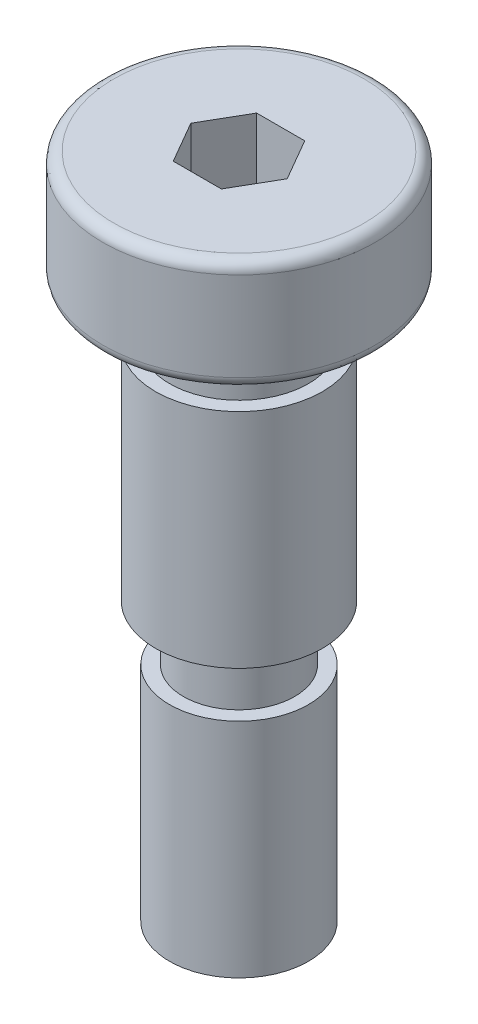
ISO-10303-21;
HEADER;
FILE_DESCRIPTION(('STEP AP214'),'2;1');
FILE_NAME('part.step','',(''),(''),'','','');
FILE_SCHEMA(('AUTOMOTIVE_DESIGN { 1 0 10303 214 1 1 1 1 }'));
ENDSEC;
DATA;
#1=APPLICATION_CONTEXT('core data for automotive mechanical design processes');
#2=APPLICATION_PROTOCOL_DEFINITION('international standard','automotive_design',2000,#1);
#3=PRODUCT_CONTEXT('',#1,'mechanical');
#4=PRODUCT('Part','Part','',(#3));
#5=PRODUCT_RELATED_PRODUCT_CATEGORY('part','',(#4));
#6=PRODUCT_DEFINITION_FORMATION('','',#4);
#7=PRODUCT_DEFINITION_CONTEXT('part definition',#1,'design');
#8=PRODUCT_DEFINITION('design','',#6,#7);
#9=PRODUCT_DEFINITION_SHAPE('','',#8);
#10=(LENGTH_UNIT() NAMED_UNIT(*) SI_UNIT(.MILLI.,.METRE.));
#11=(NAMED_UNIT(*) PLANE_ANGLE_UNIT() SI_UNIT($,.RADIAN.));
#12=(NAMED_UNIT(*) SI_UNIT($,.STERADIAN.) SOLID_ANGLE_UNIT());
#13=UNCERTAINTY_MEASURE_WITH_UNIT(LENGTH_MEASURE(1.E-05),#10,'distance_accuracy_value','');
#14=(GEOMETRIC_REPRESENTATION_CONTEXT(3) GLOBAL_UNCERTAINTY_ASSIGNED_CONTEXT((#13)) GLOBAL_UNIT_ASSIGNED_CONTEXT((#10,
#11,#12)) REPRESENTATION_CONTEXT('',''));
#15=CARTESIAN_POINT('',(0.,0.,0.));
#16=DIRECTION('',(0.,0.,1.));
#17=DIRECTION('',(1.,0.,0.));
#18=AXIS2_PLACEMENT_3D('',#15,#16,#17);
#19=CARTESIAN_POINT('',(0.,24.,0.));
#20=DIRECTION('',(0.,-1.,0.));
#21=DIRECTION('',(0.,0.,-1.));
#22=AXIS2_PLACEMENT_3D('',#19,#20,#21);
#23=PLANE('',#22);
#24=DIRECTION('',(-1.,0.,0.));
#25=VECTOR('',#24,1.);
#26=CARTESIAN_POINT('',(0.866025403784438,24.,-1.5));
#27=LINE('',#26,#25);
#28=CARTESIAN_POINT('',(0.866025403784438,24.,-1.5));
#29=VERTEX_POINT('',#28);
#30=CARTESIAN_POINT('',(-0.866025403784439,24.,-1.5));
#31=VERTEX_POINT('',#30);
#32=EDGE_CURVE('E126',#29,#31,#27,.T.);
#33=ORIENTED_EDGE('',*,*,#32,.F.);
#34=DIRECTION('',(-0.5,0.,-0.866025403784438));
#35=VECTOR('',#34,1.);
#36=CARTESIAN_POINT('',(1.73205080756888,24.,0.));
#37=LINE('',#36,#35);
#38=CARTESIAN_POINT('',(1.73205080756888,24.,0.));
#39=VERTEX_POINT('',#38);
#40=EDGE_CURVE('E52',#39,#29,#37,.T.);
#41=ORIENTED_EDGE('',*,*,#40,.F.);
#42=DIRECTION('',(0.5,0.,-0.866025403784438));
#43=VECTOR('',#42,1.);
#44=CARTESIAN_POINT('',(0.866025403784438,24.,1.5));
#45=LINE('',#44,#43);
#46=CARTESIAN_POINT('',(0.866025403784438,24.,1.5));
#47=VERTEX_POINT('',#46);
#48=EDGE_CURVE('E135',#47,#39,#45,.T.);
#49=ORIENTED_EDGE('',*,*,#48,.F.);
#50=DIRECTION('',(1.,0.,0.));
#51=VECTOR('',#50,1.);
#52=CARTESIAN_POINT('',(-0.866025403784439,24.,1.5));
#53=LINE('',#52,#51);
#54=CARTESIAN_POINT('',(-0.866025403784439,24.,1.5));
#55=VERTEX_POINT('',#54);
#56=EDGE_CURVE('E133',#55,#47,#53,.T.);
#57=ORIENTED_EDGE('',*,*,#56,.F.);
#58=DIRECTION('',(0.5,0.,0.866025403784439));
#59=VECTOR('',#58,1.);
#60=CARTESIAN_POINT('',(-1.73205080756888,24.,0.));
#61=LINE('',#60,#59);
#62=CARTESIAN_POINT('',(-1.73205080756888,24.,0.));
#63=VERTEX_POINT('',#62);
#64=EDGE_CURVE('E100',#63,#55,#61,.T.);
#65=ORIENTED_EDGE('',*,*,#64,.F.);
#66=DIRECTION('',(-0.5,0.,0.866025403784439));
#67=VECTOR('',#66,1.);
#68=CARTESIAN_POINT('',(-0.866025403784439,24.,-1.5));
#69=LINE('',#68,#67);
#70=EDGE_CURVE('E129',#31,#63,#69,.T.);
#71=ORIENTED_EDGE('',*,*,#70,.F.);
#72=EDGE_LOOP('',(#33,#41,#49,#57,#65,#71));
#73=FACE_BOUND('',#72,.T.);
#74=CARTESIAN_POINT('',(0.,24.,0.));
#75=DIRECTION('',(0.,-1.,0.));
#76=DIRECTION('',(0.,0.,-1.));
#77=AXIS2_PLACEMENT_3D('',#74,#75,#76);
#78=CIRCLE('',#77,4.5);
#79=CARTESIAN_POINT('',(0.,24.,-4.5));
#80=VERTEX_POINT('',#79);
#81=EDGE_CURVE('E11',#80,#80,#78,.T.);
#82=ORIENTED_EDGE('',*,*,#81,.F.);
#83=EDGE_LOOP('',(#82));
#84=FACE_BOUND('',#83,.T.);
#85=ADVANCED_FACE('F38',(#73,#84),#23,.F.);
#86=CARTESIAN_POINT('',(0.,23.6,0.));
#87=DIRECTION('',(0.,-1.,0.));
#88=DIRECTION('',(0.,0.,-1.));
#89=AXIS2_PLACEMENT_3D('',#86,#87,#88);
#90=TOROIDAL_SURFACE('',#89,4.5,0.400000000000001);
#91=CARTESIAN_POINT('',(0.,23.6,0.));
#92=DIRECTION('',(0.,-1.,0.));
#93=DIRECTION('',(0.,0.,-1.));
#94=AXIS2_PLACEMENT_3D('',#91,#92,#93);
#95=CIRCLE('',#94,4.9);
#96=CARTESIAN_POINT('',(0.,23.6,-4.9));
#97=VERTEX_POINT('',#96);
#98=EDGE_CURVE('E45',#97,#97,#95,.T.);
#99=ORIENTED_EDGE('',*,*,#98,.F.);
#100=EDGE_LOOP('',(#99));
#101=FACE_BOUND('',#100,.T.);
#102=ORIENTED_EDGE('',*,*,#81,.T.);
#103=EDGE_LOOP('',(#102));
#104=FACE_BOUND('',#103,.T.);
#105=ADVANCED_FACE('F178',(#101,#104),#90,.T.);
#106=CARTESIAN_POINT('',(0.,0.,0.));
#107=DIRECTION('',(0.,-1.,0.));
#108=DIRECTION('',(0.,0.,-1.));
#109=AXIS2_PLACEMENT_3D('',#106,#107,#108);
#110=CYLINDRICAL_SURFACE('',#109,4.9);
#111=CARTESIAN_POINT('',(0.,20.4,0.));
#112=DIRECTION('',(0.,-1.,0.));
#113=DIRECTION('',(0.,0.,-1.));
#114=AXIS2_PLACEMENT_3D('',#111,#112,#113);
#115=CIRCLE('',#114,4.9);
#116=CARTESIAN_POINT('',(0.,20.4,-4.9));
#117=VERTEX_POINT('',#116);
#118=EDGE_CURVE('E171',#117,#117,#115,.T.);
#119=ORIENTED_EDGE('',*,*,#118,.F.);
#120=EDGE_LOOP('',(#119));
#121=FACE_BOUND('',#120,.T.);
#122=ORIENTED_EDGE('',*,*,#98,.T.);
#123=EDGE_LOOP('',(#122));
#124=FACE_BOUND('',#123,.T.);
#125=ADVANCED_FACE('F176',(#121,#124),#110,.T.);
#126=CARTESIAN_POINT('',(0.,20.4,0.));
#127=DIRECTION('',(0.,-1.,0.));
#128=DIRECTION('',(0.,0.,-1.));
#129=AXIS2_PLACEMENT_3D('',#126,#127,#128);
#130=TOROIDAL_SURFACE('',#129,4.5,0.400000000000004);
#131=CARTESIAN_POINT('',(0.,20.,0.));
#132=DIRECTION('',(0.,-1.,0.));
#133=DIRECTION('',(0.,0.,-1.));
#134=AXIS2_PLACEMENT_3D('',#131,#132,#133);
#135=CIRCLE('',#134,4.5);
#136=CARTESIAN_POINT('',(0.,20.,-4.5));
#137=VERTEX_POINT('',#136);
#138=EDGE_CURVE('E168',#137,#137,#135,.T.);
#139=ORIENTED_EDGE('',*,*,#138,.F.);
#140=EDGE_LOOP('',(#139));
#141=FACE_BOUND('',#140,.T.);
#142=ORIENTED_EDGE('',*,*,#118,.T.);
#143=EDGE_LOOP('',(#142));
#144=FACE_BOUND('',#143,.T.);
#145=ADVANCED_FACE('F239',(#141,#144),#130,.T.);
#146=CARTESIAN_POINT('',(-4.5,20.,0.));
#147=DIRECTION('',(0.,1.,0.));
#148=DIRECTION('',(0.,0.,1.));
#149=AXIS2_PLACEMENT_3D('',#146,#147,#148);
#150=PLANE('',#149);
#151=CARTESIAN_POINT('',(0.,20.,0.));
#152=DIRECTION('',(0.,-1.,0.));
#153=DIRECTION('',(0.,0.,-1.));
#154=AXIS2_PLACEMENT_3D('',#151,#152,#153);
#155=CIRCLE('',#154,2.5);
#156=CARTESIAN_POINT('',(0.,20.,-2.5));
#157=VERTEX_POINT('',#156);
#158=EDGE_CURVE('E165',#157,#157,#155,.T.);
#159=ORIENTED_EDGE('',*,*,#158,.F.);
#160=EDGE_LOOP('',(#159));
#161=FACE_BOUND('',#160,.T.);
#162=ORIENTED_EDGE('',*,*,#138,.T.);
#163=EDGE_LOOP('',(#162));
#164=FACE_BOUND('',#163,.T.);
#165=ADVANCED_FACE('F235',(#161,#164),#150,.F.);
#166=CARTESIAN_POINT('',(0.,0.,0.));
#167=DIRECTION('',(0.,-1.,0.));
#168=DIRECTION('',(0.,0.,-1.));
#169=AXIS2_PLACEMENT_3D('',#166,#167,#168);
#170=CYLINDRICAL_SURFACE('',#169,2.5);
#171=CARTESIAN_POINT('',(0.,18.,0.));
#172=DIRECTION('',(0.,-1.,0.));
#173=DIRECTION('',(0.,0.,-1.));
#174=AXIS2_PLACEMENT_3D('',#171,#172,#173);
#175=CIRCLE('',#174,2.5);
#176=CARTESIAN_POINT('',(0.,18.,-2.5));
#177=VERTEX_POINT('',#176);
#178=EDGE_CURVE('E162',#177,#177,#175,.T.);
#179=ORIENTED_EDGE('',*,*,#178,.F.);
#180=EDGE_LOOP('',(#179));
#181=FACE_BOUND('',#180,.T.);
#182=ORIENTED_EDGE('',*,*,#158,.T.);
#183=EDGE_LOOP('',(#182));
#184=FACE_BOUND('',#183,.T.);
#185=ADVANCED_FACE('F231',(#181,#184),#170,.T.);
#186=CARTESIAN_POINT('',(-2.5,18.,0.));
#187=DIRECTION('',(0.,-1.,0.));
#188=DIRECTION('',(0.,0.,-1.));
#189=AXIS2_PLACEMENT_3D('',#186,#187,#188);
#190=PLANE('',#189);
#191=CARTESIAN_POINT('',(0.,18.,0.));
#192=DIRECTION('',(0.,-1.,0.));
#193=DIRECTION('',(0.,0.,-1.));
#194=AXIS2_PLACEMENT_3D('',#191,#192,#193);
#195=CIRCLE('',#194,3.);
#196=CARTESIAN_POINT('',(0.,18.,-3.));
#197=VERTEX_POINT('',#196);
#198=EDGE_CURVE('E159',#197,#197,#195,.T.);
#199=ORIENTED_EDGE('',*,*,#198,.F.);
#200=EDGE_LOOP('',(#199));
#201=FACE_BOUND('',#200,.T.);
#202=ORIENTED_EDGE('',*,*,#178,.T.);
#203=EDGE_LOOP('',(#202));
#204=FACE_BOUND('',#203,.T.);
#205=ADVANCED_FACE('F227',(#201,#204),#190,.F.);
#206=CARTESIAN_POINT('',(0.,0.,0.));
#207=DIRECTION('',(0.,-1.,0.));
#208=DIRECTION('',(0.,0.,-1.));
#209=AXIS2_PLACEMENT_3D('',#206,#207,#208);
#210=CYLINDRICAL_SURFACE('',#209,3.);
#211=CARTESIAN_POINT('',(0.,10.,0.));
#212=DIRECTION('',(0.,-1.,0.));
#213=DIRECTION('',(0.,0.,-1.));
#214=AXIS2_PLACEMENT_3D('',#211,#212,#213);
#215=CIRCLE('',#214,3.);
#216=CARTESIAN_POINT('',(0.,10.,-3.));
#217=VERTEX_POINT('',#216);
#218=EDGE_CURVE('E156',#217,#217,#215,.T.);
#219=ORIENTED_EDGE('',*,*,#218,.F.);
#220=EDGE_LOOP('',(#219));
#221=FACE_BOUND('',#220,.T.);
#222=ORIENTED_EDGE('',*,*,#198,.T.);
#223=EDGE_LOOP('',(#222));
#224=FACE_BOUND('',#223,.T.);
#225=ADVANCED_FACE('F223',(#221,#224),#210,.T.);
#226=CARTESIAN_POINT('',(-3.,10.,0.));
#227=DIRECTION('',(0.,1.,0.));
#228=DIRECTION('',(0.,0.,1.));
#229=AXIS2_PLACEMENT_3D('',#226,#227,#228);
#230=PLANE('',#229);
#231=CARTESIAN_POINT('',(0.,10.,0.));
#232=DIRECTION('',(0.,-1.,0.));
#233=DIRECTION('',(0.,0.,-1.));
#234=AXIS2_PLACEMENT_3D('',#231,#232,#233);
#235=CIRCLE('',#234,2.);
#236=CARTESIAN_POINT('',(0.,10.,-2.));
#237=VERTEX_POINT('',#236);
#238=EDGE_CURVE('E153',#237,#237,#235,.T.);
#239=ORIENTED_EDGE('',*,*,#238,.F.);
#240=EDGE_LOOP('',(#239));
#241=FACE_BOUND('',#240,.T.);
#242=ORIENTED_EDGE('',*,*,#218,.T.);
#243=EDGE_LOOP('',(#242));
#244=FACE_BOUND('',#243,.T.);
#245=ADVANCED_FACE('F219',(#241,#244),#230,.F.);
#246=CARTESIAN_POINT('',(0.,0.,0.));
#247=DIRECTION('',(0.,-1.,0.));
#248=DIRECTION('',(0.,0.,-1.));
#249=AXIS2_PLACEMENT_3D('',#246,#247,#248);
#250=CYLINDRICAL_SURFACE('',#249,2.);
#251=CARTESIAN_POINT('',(0.,8.,0.));
#252=DIRECTION('',(0.,-1.,0.));
#253=DIRECTION('',(0.,0.,-1.));
#254=AXIS2_PLACEMENT_3D('',#251,#252,#253);
#255=CIRCLE('',#254,2.);
#256=CARTESIAN_POINT('',(0.,8.,-2.));
#257=VERTEX_POINT('',#256);
#258=EDGE_CURVE('E150',#257,#257,#255,.T.);
#259=ORIENTED_EDGE('',*,*,#258,.F.);
#260=EDGE_LOOP('',(#259));
#261=FACE_BOUND('',#260,.T.);
#262=ORIENTED_EDGE('',*,*,#238,.T.);
#263=EDGE_LOOP('',(#262));
#264=FACE_BOUND('',#263,.T.);
#265=ADVANCED_FACE('F215',(#261,#264),#250,.T.);
#266=CARTESIAN_POINT('',(-2.,8.,0.));
#267=DIRECTION('',(0.,-1.,0.));
#268=DIRECTION('',(0.,0.,-1.));
#269=AXIS2_PLACEMENT_3D('',#266,#267,#268);
#270=PLANE('',#269);
#271=CARTESIAN_POINT('',(0.,8.,0.));
#272=DIRECTION('',(0.,-1.,0.));
#273=DIRECTION('',(0.,0.,-1.));
#274=AXIS2_PLACEMENT_3D('',#271,#272,#273);
#275=CIRCLE('',#274,2.5);
#276=CARTESIAN_POINT('',(0.,8.,-2.5));
#277=VERTEX_POINT('',#276);
#278=EDGE_CURVE('E147',#277,#277,#275,.T.);
#279=ORIENTED_EDGE('',*,*,#278,.F.);
#280=EDGE_LOOP('',(#279));
#281=FACE_BOUND('',#280,.T.);
#282=ORIENTED_EDGE('',*,*,#258,.T.);
#283=EDGE_LOOP('',(#282));
#284=FACE_BOUND('',#283,.T.);
#285=ADVANCED_FACE('F211',(#281,#284),#270,.F.);
#286=CARTESIAN_POINT('',(0.,0.,0.));
#287=DIRECTION('',(0.,-1.,0.));
#288=DIRECTION('',(0.,0.,-1.));
#289=AXIS2_PLACEMENT_3D('',#286,#287,#288);
#290=CYLINDRICAL_SURFACE('',#289,2.5);
#291=CARTESIAN_POINT('',(0.,0.,0.));
#292=DIRECTION('',(0.,-1.,0.));
#293=DIRECTION('',(0.,0.,-1.));
#294=AXIS2_PLACEMENT_3D('',#291,#292,#293);
#295=CIRCLE('',#294,2.5);
#296=CARTESIAN_POINT('',(0.,0.,-2.5));
#297=VERTEX_POINT('',#296);
#298=EDGE_CURVE('E139',#297,#297,#295,.T.);
#299=ORIENTED_EDGE('',*,*,#298,.F.);
#300=EDGE_LOOP('',(#299));
#301=FACE_BOUND('',#300,.T.);
#302=ORIENTED_EDGE('',*,*,#278,.T.);
#303=EDGE_LOOP('',(#302));
#304=FACE_BOUND('',#303,.T.);
#305=ADVANCED_FACE('F203',(#301,#304),#290,.T.);
#306=CARTESIAN_POINT('',(-2.5,0.,0.));
#307=DIRECTION('',(0.,1.,0.));
#308=DIRECTION('',(0.,0.,1.));
#309=AXIS2_PLACEMENT_3D('',#306,#307,#308);
#310=PLANE('',#309);
#311=ORIENTED_EDGE('',*,*,#298,.T.);
#312=EDGE_LOOP('',(#311));
#313=FACE_BOUND('',#312,.T.);
#314=ADVANCED_FACE('F196',(#313),#310,.F.);
#315=CARTESIAN_POINT('',(1.73205080756888,20.5,0.));
#316=DIRECTION('',(0.866025403784438,0.,-0.5));
#317=DIRECTION('',(-0.5,0.,-0.866025403784439));
#318=AXIS2_PLACEMENT_3D('',#315,#316,#317);
#319=PLANE('',#318);
#320=ORIENTED_EDGE('',*,*,#40,.T.);
#321=DIRECTION('',(0.,1.,0.));
#322=VECTOR('',#321,1.);
#323=CARTESIAN_POINT('',(0.866025403784438,20.5,-1.5));
#324=LINE('',#323,#322);
#325=CARTESIAN_POINT('',(0.866025403784438,20.5,-1.5));
#326=VERTEX_POINT('',#325);
#327=EDGE_CURVE('E82',#326,#29,#324,.T.);
#328=ORIENTED_EDGE('',*,*,#327,.F.);
#329=DIRECTION('',(-0.5,0.,-0.866025403784438));
#330=VECTOR('',#329,1.);
#331=CARTESIAN_POINT('',(1.73205080756888,20.5,0.));
#332=LINE('',#331,#330);
#333=CARTESIAN_POINT('',(1.73205080756888,20.5,0.));
#334=VERTEX_POINT('',#333);
#335=EDGE_CURVE('E137',#334,#326,#332,.T.);
#336=ORIENTED_EDGE('',*,*,#335,.F.);
#337=DIRECTION('',(0.,1.,0.));
#338=VECTOR('',#337,1.);
#339=CARTESIAN_POINT('',(1.73205080756888,20.5,0.));
#340=LINE('',#339,#338);
#341=EDGE_CURVE('E60',#334,#39,#340,.T.);
#342=ORIENTED_EDGE('',*,*,#341,.T.);
#343=EDGE_LOOP('',(#320,#328,#336,#342));
#344=FACE_BOUND('',#343,.T.);
#345=ADVANCED_FACE('F193',(#344),#319,.F.);
#346=CARTESIAN_POINT('',(0.866025403784438,20.5,1.5));
#347=DIRECTION('',(0.866025403784438,0.,0.5));
#348=DIRECTION('',(0.5,0.,-0.866025403784439));
#349=AXIS2_PLACEMENT_3D('',#346,#347,#348);
#350=PLANE('',#349);
#351=ORIENTED_EDGE('',*,*,#48,.T.);
#352=ORIENTED_EDGE('',*,*,#341,.F.);
#353=DIRECTION('',(0.5,0.,-0.866025403784438));
#354=VECTOR('',#353,1.);
#355=CARTESIAN_POINT('',(0.866025403784438,20.5,1.5));
#356=LINE('',#355,#354);
#357=CARTESIAN_POINT('',(0.866025403784438,20.5,1.5));
#358=VERTEX_POINT('',#357);
#359=EDGE_CURVE('E112',#358,#334,#356,.T.);
#360=ORIENTED_EDGE('',*,*,#359,.F.);
#361=DIRECTION('',(0.,1.,0.));
#362=VECTOR('',#361,1.);
#363=CARTESIAN_POINT('',(0.866025403784438,20.5,1.5));
#364=LINE('',#363,#362);
#365=EDGE_CURVE('E104',#358,#47,#364,.T.);
#366=ORIENTED_EDGE('',*,*,#365,.T.);
#367=EDGE_LOOP('',(#351,#352,#360,#366));
#368=FACE_BOUND('',#367,.T.);
#369=ADVANCED_FACE('F195',(#368),#350,.F.);
#370=CARTESIAN_POINT('',(-0.866025403784439,20.5,1.5));
#371=DIRECTION('',(0.,0.,1.));
#372=DIRECTION('',(1.,0.,0.));
#373=AXIS2_PLACEMENT_3D('',#370,#371,#372);
#374=PLANE('',#373);
#375=ORIENTED_EDGE('',*,*,#56,.T.);
#376=ORIENTED_EDGE('',*,*,#365,.F.);
#377=DIRECTION('',(1.,0.,0.));
#378=VECTOR('',#377,1.);
#379=CARTESIAN_POINT('',(-0.866025403784439,20.5,1.5));
#380=LINE('',#379,#378);
#381=CARTESIAN_POINT('',(-0.866025403784439,20.5,1.5));
#382=VERTEX_POINT('',#381);
#383=EDGE_CURVE('E108',#382,#358,#380,.T.);
#384=ORIENTED_EDGE('',*,*,#383,.F.);
#385=DIRECTION('',(0.,1.,0.));
#386=VECTOR('',#385,1.);
#387=CARTESIAN_POINT('',(-0.866025403784439,20.5,1.5));
#388=LINE('',#387,#386);
#389=EDGE_CURVE('E93',#382,#55,#388,.T.);
#390=ORIENTED_EDGE('',*,*,#389,.T.);
#391=EDGE_LOOP('',(#375,#376,#384,#390));
#392=FACE_BOUND('',#391,.T.);
#393=ADVANCED_FACE('F109',(#392),#374,.F.);
#394=CARTESIAN_POINT('',(-1.73205080756888,20.5,0.));
#395=DIRECTION('',(-0.866025403784439,0.,0.5));
#396=DIRECTION('',(0.5,0.,0.866025403784439));
#397=AXIS2_PLACEMENT_3D('',#394,#395,#396);
#398=PLANE('',#397);
#399=ORIENTED_EDGE('',*,*,#64,.T.);
#400=ORIENTED_EDGE('',*,*,#389,.F.);
#401=DIRECTION('',(0.5,0.,0.866025403784439));
#402=VECTOR('',#401,1.);
#403=CARTESIAN_POINT('',(-1.73205080756888,20.5,0.));
#404=LINE('',#403,#402);
#405=CARTESIAN_POINT('',(-1.73205080756888,20.5,0.));
#406=VERTEX_POINT('',#405);
#407=EDGE_CURVE('E97',#406,#382,#404,.T.);
#408=ORIENTED_EDGE('',*,*,#407,.F.);
#409=DIRECTION('',(0.,1.,0.));
#410=VECTOR('',#409,1.);
#411=CARTESIAN_POINT('',(-1.73205080756888,20.5,0.));
#412=LINE('',#411,#410);
#413=EDGE_CURVE('E105',#406,#63,#412,.T.);
#414=ORIENTED_EDGE('',*,*,#413,.T.);
#415=EDGE_LOOP('',(#399,#400,#408,#414));
#416=FACE_BOUND('',#415,.T.);
#417=ADVANCED_FACE('F95',(#416),#398,.F.);
#418=CARTESIAN_POINT('',(-0.866025403784439,20.5,-1.5));
#419=DIRECTION('',(-0.866025403784439,0.,-0.5));
#420=DIRECTION('',(-0.5,0.,0.866025403784439));
#421=AXIS2_PLACEMENT_3D('',#418,#419,#420);
#422=PLANE('',#421);
#423=ORIENTED_EDGE('',*,*,#70,.T.);
#424=ORIENTED_EDGE('',*,*,#413,.F.);
#425=DIRECTION('',(-0.5,0.,0.866025403784439));
#426=VECTOR('',#425,1.);
#427=CARTESIAN_POINT('',(-0.866025403784439,20.5,-1.5));
#428=LINE('',#427,#426);
#429=CARTESIAN_POINT('',(-0.866025403784439,20.5,-1.5));
#430=VERTEX_POINT('',#429);
#431=EDGE_CURVE('E118',#430,#406,#428,.T.);
#432=ORIENTED_EDGE('',*,*,#431,.F.);
#433=DIRECTION('',(0.,1.,0.));
#434=VECTOR('',#433,1.);
#435=CARTESIAN_POINT('',(-0.866025403784439,20.5,-1.5));
#436=LINE('',#435,#434);
#437=EDGE_CURVE('E142',#430,#31,#436,.T.);
#438=ORIENTED_EDGE('',*,*,#437,.T.);
#439=EDGE_LOOP('',(#423,#424,#432,#438));
#440=FACE_BOUND('',#439,.T.);
#441=ADVANCED_FACE('F326',(#440),#422,.F.);
#442=CARTESIAN_POINT('',(0.866025403784438,20.5,-1.5));
#443=DIRECTION('',(0.,0.,-1.));
#444=DIRECTION('',(-1.,0.,0.));
#445=AXIS2_PLACEMENT_3D('',#442,#443,#444);
#446=PLANE('',#445);
#447=ORIENTED_EDGE('',*,*,#32,.T.);
#448=ORIENTED_EDGE('',*,*,#437,.F.);
#449=DIRECTION('',(-1.,0.,0.));
#450=VECTOR('',#449,1.);
#451=CARTESIAN_POINT('',(0.866025403784438,20.5,-1.5));
#452=LINE('',#451,#450);
#453=EDGE_CURVE('E120',#326,#430,#452,.T.);
#454=ORIENTED_EDGE('',*,*,#453,.F.);
#455=ORIENTED_EDGE('',*,*,#327,.T.);
#456=EDGE_LOOP('',(#447,#448,#454,#455));
#457=FACE_BOUND('',#456,.T.);
#458=ADVANCED_FACE('F191',(#457),#446,.F.);
#459=CARTESIAN_POINT('',(0.,20.5,0.));
#460=DIRECTION('',(0.,1.,0.));
#461=DIRECTION('',(0.,0.,1.));
#462=AXIS2_PLACEMENT_3D('',#459,#460,#461);
#463=PLANE('',#462);
#464=ORIENTED_EDGE('',*,*,#335,.T.);
#465=ORIENTED_EDGE('',*,*,#453,.T.);
#466=ORIENTED_EDGE('',*,*,#431,.T.);
#467=ORIENTED_EDGE('',*,*,#407,.T.);
#468=ORIENTED_EDGE('',*,*,#383,.T.);
#469=ORIENTED_EDGE('',*,*,#359,.T.);
#470=EDGE_LOOP('',(#464,#465,#466,#467,#468,#469));
#471=FACE_BOUND('',#470,.T.);
#472=ADVANCED_FACE('F115',(#471),#463,.T.);
#473=CLOSED_SHELL('',(#85,#105,#125,#145,#165,#185,#205,#225,#245,#265,#285,#305,#314,#345,#369,
#393,#417,#441,#458,#472));
#474=MANIFOLD_SOLID_BREP('B2',#473);
#475=ADVANCED_BREP_SHAPE_REPRESENTATION('',(#18,#474),#14);
#476=SHAPE_DEFINITION_REPRESENTATION(#9,#475);
ENDSEC;
END-ISO-10303-21;
